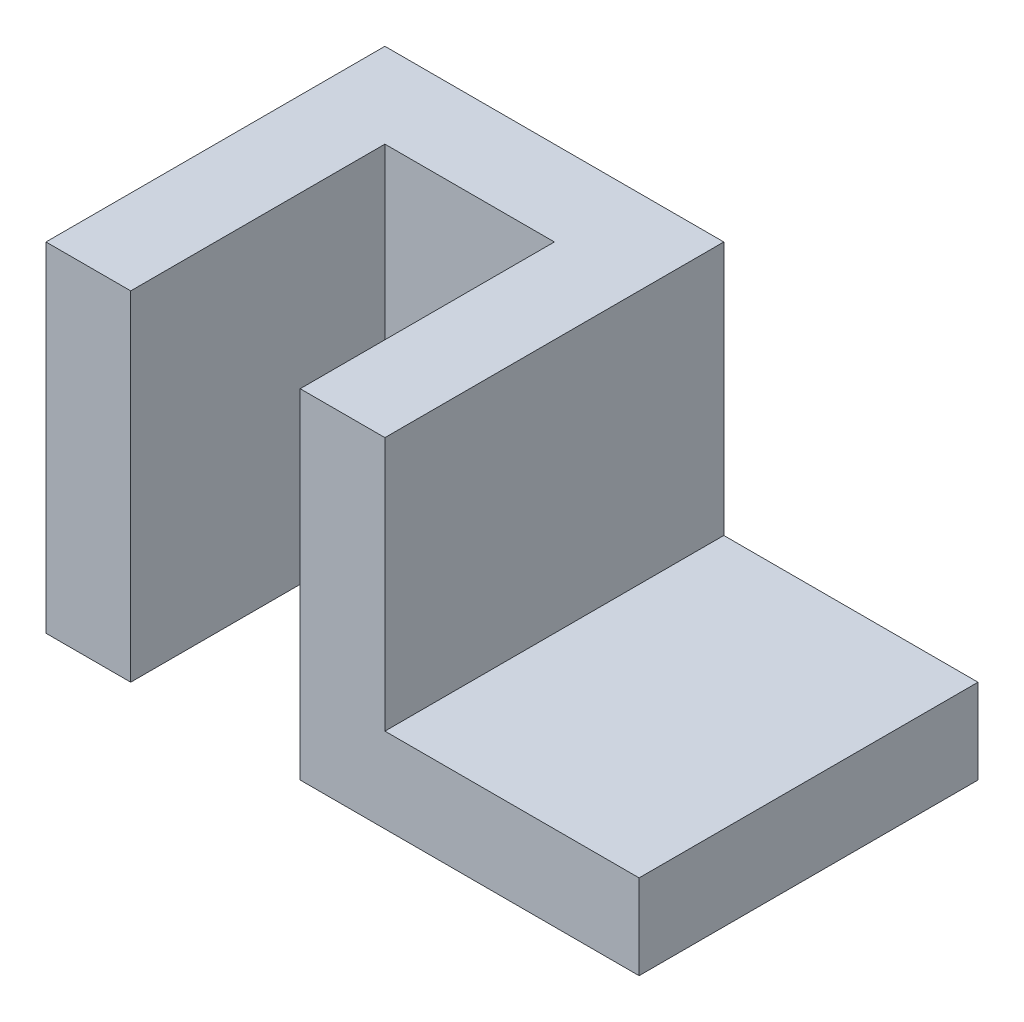
ISO-10303-21;
HEADER;
FILE_DESCRIPTION(('STEP AP214'),'2;1');
FILE_NAME('part.step','',(''),(''),'','','');
FILE_SCHEMA(('AUTOMOTIVE_DESIGN { 1 0 10303 214 1 1 1 1 }'));
ENDSEC;
DATA;
#1=APPLICATION_CONTEXT('core data for automotive mechanical design processes');
#2=APPLICATION_PROTOCOL_DEFINITION('international standard','automotive_design',2000,#1);
#3=PRODUCT_CONTEXT('',#1,'mechanical');
#4=PRODUCT('Part','Part','',(#3));
#5=PRODUCT_RELATED_PRODUCT_CATEGORY('part','',(#4));
#6=PRODUCT_DEFINITION_FORMATION('','',#4);
#7=PRODUCT_DEFINITION_CONTEXT('part definition',#1,'design');
#8=PRODUCT_DEFINITION('design','',#6,#7);
#9=PRODUCT_DEFINITION_SHAPE('','',#8);
#10=(LENGTH_UNIT() NAMED_UNIT(*) SI_UNIT(.MILLI.,.METRE.));
#11=(NAMED_UNIT(*) PLANE_ANGLE_UNIT() SI_UNIT($,.RADIAN.));
#12=(NAMED_UNIT(*) SI_UNIT($,.STERADIAN.) SOLID_ANGLE_UNIT());
#13=UNCERTAINTY_MEASURE_WITH_UNIT(LENGTH_MEASURE(1.E-05),#10,'distance_accuracy_value','');
#14=(GEOMETRIC_REPRESENTATION_CONTEXT(3) GLOBAL_UNCERTAINTY_ASSIGNED_CONTEXT((#13)) GLOBAL_UNIT_ASSIGNED_CONTEXT((#10,
#11,#12)) REPRESENTATION_CONTEXT('',''));
#15=CARTESIAN_POINT('',(0.,0.,0.));
#16=DIRECTION('',(0.,0.,1.));
#17=DIRECTION('',(1.,0.,0.));
#18=AXIS2_PLACEMENT_3D('',#15,#16,#17);
#19=CARTESIAN_POINT('',(40.,40.,-40.));
#20=DIRECTION('',(-1.,0.,0.));
#21=DIRECTION('',(0.,0.,1.));
#22=AXIS2_PLACEMENT_3D('',#19,#20,#21);
#23=PLANE('',#22);
#24=DIRECTION('',(0.,0.,1.));
#25=VECTOR('',#24,1.);
#26=CARTESIAN_POINT('',(40.,10.,0.));
#27=LINE('',#26,#25);
#28=CARTESIAN_POINT('',(40.,10.,-40.));
#29=VERTEX_POINT('',#28);
#30=CARTESIAN_POINT('',(40.,10.,0.));
#31=VERTEX_POINT('',#30);
#32=EDGE_CURVE('E55',#29,#31,#27,.T.);
#33=ORIENTED_EDGE('',*,*,#32,.F.);
#34=DIRECTION('',(0.,-1.,0.));
#35=VECTOR('',#34,1.);
#36=CARTESIAN_POINT('',(40.,40.,-40.));
#37=LINE('',#36,#35);
#38=CARTESIAN_POINT('',(40.,40.,-40.));
#39=VERTEX_POINT('',#38);
#40=EDGE_CURVE('E125',#39,#29,#37,.T.);
#41=ORIENTED_EDGE('',*,*,#40,.F.);
#42=DIRECTION('',(0.,0.,-1.));
#43=VECTOR('',#42,1.);
#44=CARTESIAN_POINT('',(40.,40.,-40.));
#45=LINE('',#44,#43);
#46=CARTESIAN_POINT('',(40.,40.,0.));
#47=VERTEX_POINT('',#46);
#48=EDGE_CURVE('E115',#47,#39,#45,.T.);
#49=ORIENTED_EDGE('',*,*,#48,.F.);
#50=DIRECTION('',(0.,-1.,0.));
#51=VECTOR('',#50,1.);
#52=CARTESIAN_POINT('',(40.,40.,0.));
#53=LINE('',#52,#51);
#54=EDGE_CURVE('E130',#47,#31,#53,.T.);
#55=ORIENTED_EDGE('',*,*,#54,.T.);
#56=EDGE_LOOP('',(#33,#41,#49,#55));
#57=FACE_BOUND('',#56,.T.);
#58=ADVANCED_FACE('F39',(#57),#23,.F.);
#59=CARTESIAN_POINT('',(10.,40.,0.));
#60=DIRECTION('',(0.,0.,-1.));
#61=DIRECTION('',(-1.,0.,0.));
#62=AXIS2_PLACEMENT_3D('',#59,#60,#61);
#63=PLANE('',#62);
#64=DIRECTION('',(1.,0.,0.));
#65=VECTOR('',#64,1.);
#66=CARTESIAN_POINT('',(10.,0.,0.));
#67=LINE('',#66,#65);
#68=CARTESIAN_POINT('',(0.,0.,0.));
#69=VERTEX_POINT('',#68);
#70=CARTESIAN_POINT('',(10.,0.,0.));
#71=VERTEX_POINT('',#70);
#72=EDGE_CURVE('E141',#69,#71,#67,.T.);
#73=ORIENTED_EDGE('',*,*,#72,.T.);
#74=DIRECTION('',(0.,-1.,0.));
#75=VECTOR('',#74,1.);
#76=CARTESIAN_POINT('',(10.,40.,0.));
#77=LINE('',#76,#75);
#78=CARTESIAN_POINT('',(10.,40.,0.));
#79=VERTEX_POINT('',#78);
#80=EDGE_CURVE('E11',#79,#71,#77,.T.);
#81=ORIENTED_EDGE('',*,*,#80,.F.);
#82=DIRECTION('',(1.,0.,0.));
#83=VECTOR('',#82,1.);
#84=CARTESIAN_POINT('',(10.,40.,0.));
#85=LINE('',#84,#83);
#86=CARTESIAN_POINT('',(0.,40.,0.));
#87=VERTEX_POINT('',#86);
#88=EDGE_CURVE('E164',#87,#79,#85,.T.);
#89=ORIENTED_EDGE('',*,*,#88,.F.);
#90=DIRECTION('',(0.,-1.,0.));
#91=VECTOR('',#90,1.);
#92=CARTESIAN_POINT('',(0.,40.,0.));
#93=LINE('',#92,#91);
#94=EDGE_CURVE('E137',#87,#69,#93,.T.);
#95=ORIENTED_EDGE('',*,*,#94,.T.);
#96=EDGE_LOOP('',(#73,#81,#89,#95));
#97=FACE_BOUND('',#96,.T.);
#98=ADVANCED_FACE('F41',(#97),#63,.F.);
#99=CARTESIAN_POINT('',(10.,40.,-30.));
#100=DIRECTION('',(-1.,0.,0.));
#101=DIRECTION('',(0.,0.,1.));
#102=AXIS2_PLACEMENT_3D('',#99,#100,#101);
#103=PLANE('',#102);
#104=DIRECTION('',(0.,0.,-1.));
#105=VECTOR('',#104,1.);
#106=CARTESIAN_POINT('',(10.,0.,-30.));
#107=LINE('',#106,#105);
#108=CARTESIAN_POINT('',(10.,0.,-30.));
#109=VERTEX_POINT('',#108);
#110=EDGE_CURVE('E145',#71,#109,#107,.T.);
#111=ORIENTED_EDGE('',*,*,#110,.T.);
#112=DIRECTION('',(0.,-1.,0.));
#113=VECTOR('',#112,1.);
#114=CARTESIAN_POINT('',(10.,40.,-30.));
#115=LINE('',#114,#113);
#116=CARTESIAN_POINT('',(10.,40.,-30.));
#117=VERTEX_POINT('',#116);
#118=EDGE_CURVE('E48',#117,#109,#115,.T.);
#119=ORIENTED_EDGE('',*,*,#118,.F.);
#120=DIRECTION('',(0.,0.,-1.));
#121=VECTOR('',#120,1.);
#122=CARTESIAN_POINT('',(10.,40.,-30.));
#123=LINE('',#122,#121);
#124=EDGE_CURVE('E99',#79,#117,#123,.T.);
#125=ORIENTED_EDGE('',*,*,#124,.F.);
#126=ORIENTED_EDGE('',*,*,#80,.T.);
#127=EDGE_LOOP('',(#111,#119,#125,#126));
#128=FACE_BOUND('',#127,.T.);
#129=ADVANCED_FACE('F249',(#128),#103,.F.);
#130=CARTESIAN_POINT('',(30.,40.,-30.));
#131=DIRECTION('',(0.,0.,-1.));
#132=DIRECTION('',(-1.,0.,0.));
#133=AXIS2_PLACEMENT_3D('',#130,#131,#132);
#134=PLANE('',#133);
#135=DIRECTION('',(1.,0.,0.));
#136=VECTOR('',#135,1.);
#137=CARTESIAN_POINT('',(30.,0.,-30.));
#138=LINE('',#137,#136);
#139=CARTESIAN_POINT('',(30.,0.,-30.));
#140=VERTEX_POINT('',#139);
#141=EDGE_CURVE('E149',#109,#140,#138,.T.);
#142=ORIENTED_EDGE('',*,*,#141,.T.);
#143=DIRECTION('',(0.,-1.,0.));
#144=VECTOR('',#143,1.);
#145=CARTESIAN_POINT('',(30.,40.,-30.));
#146=LINE('',#145,#144);
#147=CARTESIAN_POINT('',(30.,40.,-30.));
#148=VERTEX_POINT('',#147);
#149=EDGE_CURVE('E175',#148,#140,#146,.T.);
#150=ORIENTED_EDGE('',*,*,#149,.F.);
#151=DIRECTION('',(1.,0.,0.));
#152=VECTOR('',#151,1.);
#153=CARTESIAN_POINT('',(30.,40.,-30.));
#154=LINE('',#153,#152);
#155=EDGE_CURVE('E185',#117,#148,#154,.T.);
#156=ORIENTED_EDGE('',*,*,#155,.F.);
#157=ORIENTED_EDGE('',*,*,#118,.T.);
#158=EDGE_LOOP('',(#142,#150,#156,#157));
#159=FACE_BOUND('',#158,.T.);
#160=ADVANCED_FACE('F183',(#159),#134,.F.);
#161=CARTESIAN_POINT('',(30.,40.,0.));
#162=DIRECTION('',(1.,0.,0.));
#163=DIRECTION('',(0.,0.,-1.));
#164=AXIS2_PLACEMENT_3D('',#161,#162,#163);
#165=PLANE('',#164);
#166=DIRECTION('',(0.,0.,1.));
#167=VECTOR('',#166,1.);
#168=CARTESIAN_POINT('',(30.,0.,0.));
#169=LINE('',#168,#167);
#170=CARTESIAN_POINT('',(30.,0.,0.));
#171=VERTEX_POINT('',#170);
#172=EDGE_CURVE('E152',#140,#171,#169,.T.);
#173=ORIENTED_EDGE('',*,*,#172,.T.);
#174=DIRECTION('',(0.,-1.,0.));
#175=VECTOR('',#174,1.);
#176=CARTESIAN_POINT('',(30.,40.,0.));
#177=LINE('',#176,#175);
#178=CARTESIAN_POINT('',(30.,40.,0.));
#179=VERTEX_POINT('',#178);
#180=EDGE_CURVE('E171',#179,#171,#177,.T.);
#181=ORIENTED_EDGE('',*,*,#180,.F.);
#182=DIRECTION('',(0.,0.,1.));
#183=VECTOR('',#182,1.);
#184=CARTESIAN_POINT('',(30.,40.,0.));
#185=LINE('',#184,#183);
#186=EDGE_CURVE('E202',#148,#179,#185,.T.);
#187=ORIENTED_EDGE('',*,*,#186,.F.);
#188=ORIENTED_EDGE('',*,*,#149,.T.);
#189=EDGE_LOOP('',(#173,#181,#187,#188));
#190=FACE_BOUND('',#189,.T.);
#191=ADVANCED_FACE('F194',(#190),#165,.F.);
#192=CARTESIAN_POINT('',(40.,40.,0.));
#193=DIRECTION('',(0.,0.,-1.));
#194=DIRECTION('',(-1.,0.,0.));
#195=AXIS2_PLACEMENT_3D('',#192,#193,#194);
#196=PLANE('',#195);
#197=DIRECTION('',(1.,0.,0.));
#198=VECTOR('',#197,1.);
#199=CARTESIAN_POINT('',(40.,0.,0.));
#200=LINE('',#199,#198);
#201=CARTESIAN_POINT('',(70.,0.,0.));
#202=VERTEX_POINT('',#201);
#203=EDGE_CURVE('E155',#171,#202,#200,.T.);
#204=ORIENTED_EDGE('',*,*,#203,.T.);
#205=DIRECTION('',(0.,-1.,0.));
#206=VECTOR('',#205,1.);
#207=CARTESIAN_POINT('',(70.,0.,0.));
#208=LINE('',#207,#206);
#209=CARTESIAN_POINT('',(70.,10.,0.));
#210=VERTEX_POINT('',#209);
#211=EDGE_CURVE('E220',#210,#202,#208,.T.);
#212=ORIENTED_EDGE('',*,*,#211,.F.);
#213=DIRECTION('',(-1.,0.,0.));
#214=VECTOR('',#213,1.);
#215=CARTESIAN_POINT('',(70.,10.,0.));
#216=LINE('',#215,#214);
#217=EDGE_CURVE('E214',#210,#31,#216,.T.);
#218=ORIENTED_EDGE('',*,*,#217,.T.);
#219=ORIENTED_EDGE('',*,*,#54,.F.);
#220=DIRECTION('',(1.,0.,0.));
#221=VECTOR('',#220,1.);
#222=CARTESIAN_POINT('',(40.,40.,0.));
#223=LINE('',#222,#221);
#224=EDGE_CURVE('E121',#179,#47,#223,.T.);
#225=ORIENTED_EDGE('',*,*,#224,.F.);
#226=ORIENTED_EDGE('',*,*,#180,.T.);
#227=EDGE_LOOP('',(#204,#212,#218,#219,#225,#226));
#228=FACE_BOUND('',#227,.T.);
#229=ADVANCED_FACE('F197',(#228),#196,.F.);
#230=CARTESIAN_POINT('',(0.,40.,-40.));
#231=DIRECTION('',(0.,0.,1.));
#232=DIRECTION('',(1.,0.,0.));
#233=AXIS2_PLACEMENT_3D('',#230,#231,#232);
#234=PLANE('',#233);
#235=DIRECTION('',(-1.,0.,0.));
#236=VECTOR('',#235,1.);
#237=CARTESIAN_POINT('',(0.,0.,-40.));
#238=LINE('',#237,#236);
#239=CARTESIAN_POINT('',(70.,0.,-40.));
#240=VERTEX_POINT('',#239);
#241=CARTESIAN_POINT('',(0.,0.,-40.));
#242=VERTEX_POINT('',#241);
#243=EDGE_CURVE('E159',#240,#242,#238,.T.);
#244=ORIENTED_EDGE('',*,*,#243,.T.);
#245=DIRECTION('',(0.,-1.,0.));
#246=VECTOR('',#245,1.);
#247=CARTESIAN_POINT('',(0.,40.,-40.));
#248=LINE('',#247,#246);
#249=CARTESIAN_POINT('',(0.,40.,-40.));
#250=VERTEX_POINT('',#249);
#251=EDGE_CURVE('E131',#250,#242,#248,.T.);
#252=ORIENTED_EDGE('',*,*,#251,.F.);
#253=DIRECTION('',(-1.,0.,0.));
#254=VECTOR('',#253,1.);
#255=CARTESIAN_POINT('',(0.,40.,-40.));
#256=LINE('',#255,#254);
#257=EDGE_CURVE('E118',#39,#250,#256,.T.);
#258=ORIENTED_EDGE('',*,*,#257,.F.);
#259=ORIENTED_EDGE('',*,*,#40,.T.);
#260=DIRECTION('',(-1.,0.,0.));
#261=VECTOR('',#260,1.);
#262=CARTESIAN_POINT('',(70.,10.,-40.));
#263=LINE('',#262,#261);
#264=CARTESIAN_POINT('',(70.,10.,-40.));
#265=VERTEX_POINT('',#264);
#266=EDGE_CURVE('E146',#265,#29,#263,.T.);
#267=ORIENTED_EDGE('',*,*,#266,.F.);
#268=DIRECTION('',(0.,1.,0.));
#269=VECTOR('',#268,1.);
#270=CARTESIAN_POINT('',(70.,0.,-40.));
#271=LINE('',#270,#269);
#272=EDGE_CURVE('E224',#240,#265,#271,.T.);
#273=ORIENTED_EDGE('',*,*,#272,.F.);
#274=EDGE_LOOP('',(#244,#252,#258,#259,#267,#273));
#275=FACE_BOUND('',#274,.T.);
#276=ADVANCED_FACE('F133',(#275),#234,.F.);
#277=CARTESIAN_POINT('',(0.,40.,0.));
#278=DIRECTION('',(1.,0.,0.));
#279=DIRECTION('',(0.,0.,-1.));
#280=AXIS2_PLACEMENT_3D('',#277,#278,#279);
#281=PLANE('',#280);
#282=DIRECTION('',(0.,0.,1.));
#283=VECTOR('',#282,1.);
#284=CARTESIAN_POINT('',(0.,0.,0.));
#285=LINE('',#284,#283);
#286=EDGE_CURVE('E91',#242,#69,#285,.T.);
#287=ORIENTED_EDGE('',*,*,#286,.T.);
#288=ORIENTED_EDGE('',*,*,#94,.F.);
#289=DIRECTION('',(0.,0.,1.));
#290=VECTOR('',#289,1.);
#291=CARTESIAN_POINT('',(0.,40.,0.));
#292=LINE('',#291,#290);
#293=EDGE_CURVE('E64',#250,#87,#292,.T.);
#294=ORIENTED_EDGE('',*,*,#293,.F.);
#295=ORIENTED_EDGE('',*,*,#251,.T.);
#296=EDGE_LOOP('',(#287,#288,#294,#295));
#297=FACE_BOUND('',#296,.T.);
#298=ADVANCED_FACE('F245',(#297),#281,.F.);
#299=CARTESIAN_POINT('',(0.,40.,0.));
#300=DIRECTION('',(0.,-1.,0.));
#301=DIRECTION('',(0.,0.,-1.));
#302=AXIS2_PLACEMENT_3D('',#299,#300,#301);
#303=PLANE('',#302);
#304=ORIENTED_EDGE('',*,*,#88,.T.);
#305=ORIENTED_EDGE('',*,*,#124,.T.);
#306=ORIENTED_EDGE('',*,*,#155,.T.);
#307=ORIENTED_EDGE('',*,*,#186,.T.);
#308=ORIENTED_EDGE('',*,*,#224,.T.);
#309=ORIENTED_EDGE('',*,*,#48,.T.);
#310=ORIENTED_EDGE('',*,*,#257,.T.);
#311=ORIENTED_EDGE('',*,*,#293,.T.);
#312=EDGE_LOOP('',(#304,#305,#306,#307,#308,#309,#310,#311));
#313=FACE_BOUND('',#312,.T.);
#314=ADVANCED_FACE('F116',(#313),#303,.F.);
#315=CARTESIAN_POINT('',(0.,0.,0.));
#316=DIRECTION('',(0.,-1.,0.));
#317=DIRECTION('',(0.,0.,-1.));
#318=AXIS2_PLACEMENT_3D('',#315,#316,#317);
#319=PLANE('',#318);
#320=ORIENTED_EDGE('',*,*,#72,.F.);
#321=ORIENTED_EDGE('',*,*,#286,.F.);
#322=ORIENTED_EDGE('',*,*,#243,.F.);
#323=DIRECTION('',(0.,0.,-1.));
#324=VECTOR('',#323,1.);
#325=CARTESIAN_POINT('',(70.,0.,0.));
#326=LINE('',#325,#324);
#327=EDGE_CURVE('E228',#202,#240,#326,.T.);
#328=ORIENTED_EDGE('',*,*,#327,.F.);
#329=ORIENTED_EDGE('',*,*,#203,.F.);
#330=ORIENTED_EDGE('',*,*,#172,.F.);
#331=ORIENTED_EDGE('',*,*,#141,.F.);
#332=ORIENTED_EDGE('',*,*,#110,.F.);
#333=EDGE_LOOP('',(#320,#321,#322,#328,#329,#330,#331,#332));
#334=FACE_BOUND('',#333,.T.);
#335=ADVANCED_FACE('F189',(#334),#319,.T.);
#336=CARTESIAN_POINT('',(70.,10.,0.));
#337=DIRECTION('',(0.,-1.,0.));
#338=DIRECTION('',(0.,0.,-1.));
#339=AXIS2_PLACEMENT_3D('',#336,#337,#338);
#340=PLANE('',#339);
#341=ORIENTED_EDGE('',*,*,#32,.T.);
#342=ORIENTED_EDGE('',*,*,#217,.F.);
#343=DIRECTION('',(0.,0.,1.));
#344=VECTOR('',#343,1.);
#345=CARTESIAN_POINT('',(70.,10.,0.));
#346=LINE('',#345,#344);
#347=EDGE_CURVE('E217',#265,#210,#346,.T.);
#348=ORIENTED_EDGE('',*,*,#347,.F.);
#349=ORIENTED_EDGE('',*,*,#266,.T.);
#350=EDGE_LOOP('',(#341,#342,#348,#349));
#351=FACE_BOUND('',#350,.T.);
#352=ADVANCED_FACE('F296',(#351),#340,.F.);
#353=CARTESIAN_POINT('',(70.,0.,0.));
#354=DIRECTION('',(-1.,0.,0.));
#355=DIRECTION('',(0.,0.,1.));
#356=AXIS2_PLACEMENT_3D('',#353,#354,#355);
#357=PLANE('',#356);
#358=ORIENTED_EDGE('',*,*,#211,.T.);
#359=ORIENTED_EDGE('',*,*,#327,.T.);
#360=ORIENTED_EDGE('',*,*,#272,.T.);
#361=ORIENTED_EDGE('',*,*,#347,.T.);
#362=EDGE_LOOP('',(#358,#359,#360,#361));
#363=FACE_BOUND('',#362,.T.);
#364=ADVANCED_FACE('F235',(#363),#357,.F.);
#365=CLOSED_SHELL('',(#58,#98,#129,#160,#191,#229,#276,#298,#314,#335,#352,#364));
#366=MANIFOLD_SOLID_BREP('B2',#365);
#367=ADVANCED_BREP_SHAPE_REPRESENTATION('',(#18,#366),#14);
#368=SHAPE_DEFINITION_REPRESENTATION(#9,#367);
ENDSEC;
END-ISO-10303-21;
